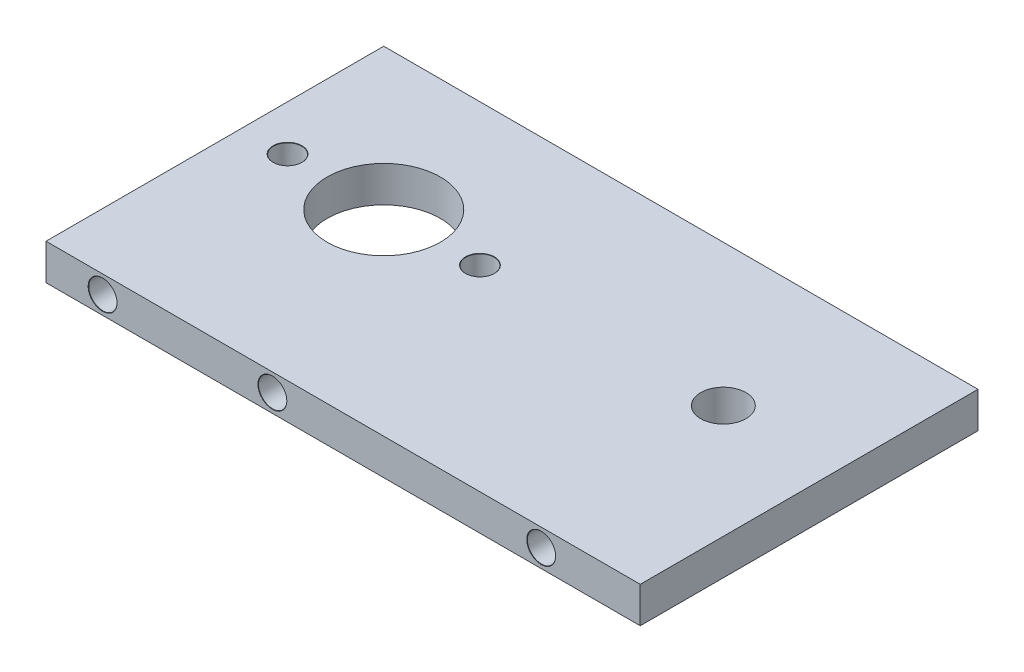
ISO-10303-21;
HEADER;
FILE_DESCRIPTION(('STEP AP214'),'2;1');
FILE_NAME('part.step','',(''),(''),'','','');
FILE_SCHEMA(('AUTOMOTIVE_DESIGN { 1 0 10303 214 1 1 1 1 }'));
ENDSEC;
DATA;
#1=APPLICATION_CONTEXT('core data for automotive mechanical design processes');
#2=APPLICATION_PROTOCOL_DEFINITION('international standard','automotive_design',2000,#1);
#3=PRODUCT_CONTEXT('',#1,'mechanical');
#4=PRODUCT('Part','Part','',(#3));
#5=PRODUCT_RELATED_PRODUCT_CATEGORY('part','',(#4));
#6=PRODUCT_DEFINITION_FORMATION('','',#4);
#7=PRODUCT_DEFINITION_CONTEXT('part definition',#1,'design');
#8=PRODUCT_DEFINITION('design','',#6,#7);
#9=PRODUCT_DEFINITION_SHAPE('','',#8);
#10=(LENGTH_UNIT() NAMED_UNIT(*) SI_UNIT(.MILLI.,.METRE.));
#11=(NAMED_UNIT(*) PLANE_ANGLE_UNIT() SI_UNIT($,.RADIAN.));
#12=(NAMED_UNIT(*) SI_UNIT($,.STERADIAN.) SOLID_ANGLE_UNIT());
#13=UNCERTAINTY_MEASURE_WITH_UNIT(LENGTH_MEASURE(1.E-05),#10,'distance_accuracy_value','');
#14=(GEOMETRIC_REPRESENTATION_CONTEXT(3) GLOBAL_UNCERTAINTY_ASSIGNED_CONTEXT((#13)) GLOBAL_UNIT_ASSIGNED_CONTEXT((#10,
#11,#12)) REPRESENTATION_CONTEXT('',''));
#15=CARTESIAN_POINT('',(0.,0.,0.));
#16=DIRECTION('',(0.,0.,1.));
#17=DIRECTION('',(1.,0.,0.));
#18=AXIS2_PLACEMENT_3D('',#15,#16,#17);
#19=CARTESIAN_POINT('',(-12.5,3.175,12.5000000000002));
#20=DIRECTION('',(1.,0.,0.));
#21=DIRECTION('',(0.,0.,-1.));
#22=AXIS2_PLACEMENT_3D('',#19,#20,#21);
#23=PLANE('',#22);
#24=DIRECTION('',(0.,0.,1.));
#25=VECTOR('',#24,1.);
#26=CARTESIAN_POINT('',(-12.5,0.,12.5000000000002));
#27=LINE('',#26,#25);
#28=CARTESIAN_POINT('',(-12.5,0.,-12.4999999999998));
#29=VERTEX_POINT('',#28);
#30=CARTESIAN_POINT('',(-12.5,0.,17.34));
#31=VERTEX_POINT('',#30);
#32=EDGE_CURVE('E72',#29,#31,#27,.T.);
#33=ORIENTED_EDGE('',*,*,#32,.T.);
#34=DIRECTION('',(0.,-1.,0.));
#35=VECTOR('',#34,1.);
#36=CARTESIAN_POINT('',(-12.5,3.175,17.34));
#37=LINE('',#36,#35);
#38=CARTESIAN_POINT('',(-12.5,3.175,17.34));
#39=VERTEX_POINT('',#38);
#40=EDGE_CURVE('E11',#39,#31,#37,.T.);
#41=ORIENTED_EDGE('',*,*,#40,.F.);
#42=DIRECTION('',(0.,0.,1.));
#43=VECTOR('',#42,1.);
#44=CARTESIAN_POINT('',(-12.5,3.175,12.5000000000002));
#45=LINE('',#44,#43);
#46=CARTESIAN_POINT('',(-12.5,3.175,-12.4999999999998));
#47=VERTEX_POINT('',#46);
#48=EDGE_CURVE('E173',#47,#39,#45,.T.);
#49=ORIENTED_EDGE('',*,*,#48,.F.);
#50=DIRECTION('',(0.,-1.,0.));
#51=VECTOR('',#50,1.);
#52=CARTESIAN_POINT('',(-12.5,3.175,-12.4999999999998));
#53=LINE('',#52,#51);
#54=EDGE_CURVE('E53',#47,#29,#53,.T.);
#55=ORIENTED_EDGE('',*,*,#54,.T.);
#56=EDGE_LOOP('',(#33,#41,#49,#55));
#57=FACE_BOUND('',#56,.T.);
#58=ADVANCED_FACE('F45',(#57),#23,.F.);
#59=CARTESIAN_POINT('',(-12.5,3.175,17.34));
#60=DIRECTION('',(0.,0.,-1.));
#61=DIRECTION('',(-1.,0.,0.));
#62=AXIS2_PLACEMENT_3D('',#59,#60,#61);
#63=PLANE('',#62);
#64=CARTESIAN_POINT('',(-7.5,1.5875,17.34));
#65=DIRECTION('',(0.,0.,1.));
#66=DIRECTION('',(1.,0.,0.));
#67=AXIS2_PLACEMENT_3D('',#64,#65,#66);
#68=CIRCLE('',#67,1.275);
#69=CARTESIAN_POINT('',(-6.225,1.5875,17.34));
#70=VERTEX_POINT('',#69);
#71=EDGE_CURVE('E114',#70,#70,#68,.T.);
#72=ORIENTED_EDGE('',*,*,#71,.F.);
#73=EDGE_LOOP('',(#72));
#74=FACE_BOUND('',#73,.T.);
#75=CARTESIAN_POINT('',(7.5,1.5875,17.34));
#76=DIRECTION('',(0.,0.,1.));
#77=DIRECTION('',(1.,0.,0.));
#78=AXIS2_PLACEMENT_3D('',#75,#76,#77);
#79=CIRCLE('',#78,1.275);
#80=CARTESIAN_POINT('',(8.775,1.5875,17.34));
#81=VERTEX_POINT('',#80);
#82=EDGE_CURVE('E107',#81,#81,#79,.T.);
#83=ORIENTED_EDGE('',*,*,#82,.F.);
#84=EDGE_LOOP('',(#83));
#85=FACE_BOUND('',#84,.T.);
#86=CARTESIAN_POINT('',(31.25,1.5875,17.34));
#87=DIRECTION('',(0.,0.,1.));
#88=DIRECTION('',(1.,0.,0.));
#89=AXIS2_PLACEMENT_3D('',#86,#87,#88);
#90=CIRCLE('',#89,1.275);
#91=CARTESIAN_POINT('',(32.525,1.5875,17.34));
#92=VERTEX_POINT('',#91);
#93=EDGE_CURVE('E123',#92,#92,#90,.T.);
#94=ORIENTED_EDGE('',*,*,#93,.F.);
#95=EDGE_LOOP('',(#94));
#96=FACE_BOUND('',#95,.T.);
#97=DIRECTION('',(1.,0.,0.));
#98=VECTOR('',#97,1.);
#99=CARTESIAN_POINT('',(-12.5,0.,17.34));
#100=LINE('',#99,#98);
#101=CARTESIAN_POINT('',(40.,0.,17.34));
#102=VERTEX_POINT('',#101);
#103=EDGE_CURVE('E78',#31,#102,#100,.T.);
#104=ORIENTED_EDGE('',*,*,#103,.T.);
#105=DIRECTION('',(0.,1.,0.));
#106=VECTOR('',#105,1.);
#107=CARTESIAN_POINT('',(40.,-40.5792508555788,17.34));
#108=LINE('',#107,#106);
#109=CARTESIAN_POINT('',(40.,3.175,17.34));
#110=VERTEX_POINT('',#109);
#111=EDGE_CURVE('E143',#102,#110,#108,.T.);
#112=ORIENTED_EDGE('',*,*,#111,.T.);
#113=DIRECTION('',(1.,0.,0.));
#114=VECTOR('',#113,1.);
#115=CARTESIAN_POINT('',(-12.5,3.175,17.34));
#116=LINE('',#115,#114);
#117=EDGE_CURVE('E175',#39,#110,#116,.T.);
#118=ORIENTED_EDGE('',*,*,#117,.F.);
#119=ORIENTED_EDGE('',*,*,#40,.T.);
#120=EDGE_LOOP('',(#104,#112,#118,#119));
#121=FACE_BOUND('',#120,.T.);
#122=ADVANCED_FACE('F193',(#74,#85,#96,#121),#63,.F.);
#123=CARTESIAN_POINT('',(12.5000000000001,3.175,-12.4999999999999));
#124=DIRECTION('',(0.,0.,1.));
#125=DIRECTION('',(1.,0.,0.));
#126=AXIS2_PLACEMENT_3D('',#123,#124,#125);
#127=PLANE('',#126);
#128=DIRECTION('',(-1.,0.,0.));
#129=VECTOR('',#128,1.);
#130=CARTESIAN_POINT('',(12.5000000000001,0.,-12.4999999999999));
#131=LINE('',#130,#129);
#132=CARTESIAN_POINT('',(40.,0.,-12.4999999999999));
#133=VERTEX_POINT('',#132);
#134=EDGE_CURVE('E176',#133,#29,#131,.T.);
#135=ORIENTED_EDGE('',*,*,#134,.T.);
#136=ORIENTED_EDGE('',*,*,#54,.F.);
#137=DIRECTION('',(-1.,0.,0.));
#138=VECTOR('',#137,1.);
#139=CARTESIAN_POINT('',(12.5000000000001,3.175,-12.4999999999999));
#140=LINE('',#139,#138);
#141=CARTESIAN_POINT('',(40.,3.175,-12.4999999999999));
#142=VERTEX_POINT('',#141);
#143=EDGE_CURVE('E61',#142,#47,#140,.T.);
#144=ORIENTED_EDGE('',*,*,#143,.F.);
#145=DIRECTION('',(0.,1.,0.));
#146=VECTOR('',#145,1.);
#147=CARTESIAN_POINT('',(40.,-40.5792508555788,-12.4999999999999));
#148=LINE('',#147,#146);
#149=EDGE_CURVE('E144',#133,#142,#148,.T.);
#150=ORIENTED_EDGE('',*,*,#149,.F.);
#151=EDGE_LOOP('',(#135,#136,#144,#150));
#152=FACE_BOUND('',#151,.T.);
#153=ADVANCED_FACE('F184',(#152),#127,.F.);
#154=CARTESIAN_POINT('',(0.,3.175,0.));
#155=DIRECTION('',(0.,1.,0.));
#156=DIRECTION('',(0.,0.,1.));
#157=AXIS2_PLACEMENT_3D('',#154,#155,#156);
#158=PLANE('',#157);
#159=CARTESIAN_POINT('',(0.,3.175,0.));
#160=DIRECTION('',(0.,1.,0.));
#161=DIRECTION('',(0.,0.,1.));
#162=AXIS2_PLACEMENT_3D('',#159,#160,#161);
#163=CIRCLE('',#162,5.);
#164=CARTESIAN_POINT('',(0.,3.175,5.));
#165=VERTEX_POINT('',#164);
#166=EDGE_CURVE('E136',#165,#165,#163,.T.);
#167=ORIENTED_EDGE('',*,*,#166,.F.);
#168=EDGE_LOOP('',(#167));
#169=FACE_BOUND('',#168,.T.);
#170=CARTESIAN_POINT('',(-8.5,3.175,0.));
#171=DIRECTION('',(0.,1.,0.));
#172=DIRECTION('',(0.,0.,1.));
#173=AXIS2_PLACEMENT_3D('',#170,#171,#172);
#174=CIRCLE('',#173,1.275);
#175=CARTESIAN_POINT('',(-8.5,3.175,1.275));
#176=VERTEX_POINT('',#175);
#177=EDGE_CURVE('E155',#176,#176,#174,.T.);
#178=ORIENTED_EDGE('',*,*,#177,.F.);
#179=EDGE_LOOP('',(#178));
#180=FACE_BOUND('',#179,.T.);
#181=CARTESIAN_POINT('',(8.5,3.175,0.));
#182=DIRECTION('',(0.,1.,0.));
#183=DIRECTION('',(0.,0.,1.));
#184=AXIS2_PLACEMENT_3D('',#181,#182,#183);
#185=CIRCLE('',#184,1.275);
#186=CARTESIAN_POINT('',(8.5,3.175,1.275));
#187=VERTEX_POINT('',#186);
#188=EDGE_CURVE('E164',#187,#187,#185,.T.);
#189=ORIENTED_EDGE('',*,*,#188,.F.);
#190=EDGE_LOOP('',(#189));
#191=FACE_BOUND('',#190,.T.);
#192=ORIENTED_EDGE('',*,*,#48,.T.);
#193=ORIENTED_EDGE('',*,*,#117,.T.);
#194=DIRECTION('',(0.,0.,1.));
#195=VECTOR('',#194,1.);
#196=CARTESIAN_POINT('',(40.,3.175,0.));
#197=LINE('',#196,#195);
#198=EDGE_CURVE('E140',#142,#110,#197,.T.);
#199=ORIENTED_EDGE('',*,*,#198,.F.);
#200=ORIENTED_EDGE('',*,*,#143,.T.);
#201=EDGE_LOOP('',(#192,#193,#199,#200));
#202=FACE_BOUND('',#201,.T.);
#203=CARTESIAN_POINT('',(30.,3.175,0.));
#204=DIRECTION('',(0.,1.,0.));
#205=DIRECTION('',(0.,0.,1.));
#206=AXIS2_PLACEMENT_3D('',#203,#204,#205);
#207=CIRCLE('',#206,2.);
#208=CARTESIAN_POINT('',(30.,3.175,2.));
#209=VERTEX_POINT('',#208);
#210=EDGE_CURVE('E132',#209,#209,#207,.T.);
#211=ORIENTED_EDGE('',*,*,#210,.F.);
#212=EDGE_LOOP('',(#211));
#213=FACE_BOUND('',#212,.T.);
#214=ADVANCED_FACE('F194',(#169,#180,#191,#202,#213),#158,.T.);
#215=CARTESIAN_POINT('',(0.,0.,0.));
#216=DIRECTION('',(0.,1.,0.));
#217=DIRECTION('',(0.,0.,1.));
#218=AXIS2_PLACEMENT_3D('',#215,#216,#217);
#219=PLANE('',#218);
#220=CARTESIAN_POINT('',(0.,0.,0.));
#221=DIRECTION('',(0.,1.,0.));
#222=DIRECTION('',(0.,0.,1.));
#223=AXIS2_PLACEMENT_3D('',#220,#221,#222);
#224=CIRCLE('',#223,5.);
#225=CARTESIAN_POINT('',(0.,0.,5.));
#226=VERTEX_POINT('',#225);
#227=EDGE_CURVE('E152',#226,#226,#224,.F.);
#228=ORIENTED_EDGE('',*,*,#227,.F.);
#229=EDGE_LOOP('',(#228));
#230=FACE_BOUND('',#229,.T.);
#231=CARTESIAN_POINT('',(-8.5,0.,0.));
#232=DIRECTION('',(0.,1.,0.));
#233=DIRECTION('',(0.,0.,1.));
#234=AXIS2_PLACEMENT_3D('',#231,#232,#233);
#235=CIRCLE('',#234,1.25);
#236=CARTESIAN_POINT('',(-8.5,0.,1.25));
#237=VERTEX_POINT('',#236);
#238=EDGE_CURVE('E161',#237,#237,#235,.T.);
#239=ORIENTED_EDGE('',*,*,#238,.T.);
#240=EDGE_LOOP('',(#239));
#241=FACE_BOUND('',#240,.T.);
#242=CARTESIAN_POINT('',(8.5,0.,0.));
#243=DIRECTION('',(0.,1.,0.));
#244=DIRECTION('',(0.,0.,1.));
#245=AXIS2_PLACEMENT_3D('',#242,#243,#244);
#246=CIRCLE('',#245,1.25);
#247=CARTESIAN_POINT('',(8.5,0.,1.25));
#248=VERTEX_POINT('',#247);
#249=EDGE_CURVE('E170',#248,#248,#246,.T.);
#250=ORIENTED_EDGE('',*,*,#249,.T.);
#251=EDGE_LOOP('',(#250));
#252=FACE_BOUND('',#251,.T.);
#253=ORIENTED_EDGE('',*,*,#32,.F.);
#254=ORIENTED_EDGE('',*,*,#134,.F.);
#255=DIRECTION('',(0.,0.,-1.));
#256=VECTOR('',#255,1.);
#257=CARTESIAN_POINT('',(40.,0.,0.));
#258=LINE('',#257,#256);
#259=EDGE_CURVE('E137',#102,#133,#258,.T.);
#260=ORIENTED_EDGE('',*,*,#259,.F.);
#261=ORIENTED_EDGE('',*,*,#103,.F.);
#262=EDGE_LOOP('',(#253,#254,#260,#261));
#263=FACE_BOUND('',#262,.T.);
#264=CARTESIAN_POINT('',(30.,0.,0.));
#265=DIRECTION('',(0.,1.,0.));
#266=DIRECTION('',(0.,0.,1.));
#267=AXIS2_PLACEMENT_3D('',#264,#265,#266);
#268=CIRCLE('',#267,2.);
#269=CARTESIAN_POINT('',(30.,0.,2.));
#270=VERTEX_POINT('',#269);
#271=EDGE_CURVE('E133',#270,#270,#268,.F.);
#272=ORIENTED_EDGE('',*,*,#271,.F.);
#273=EDGE_LOOP('',(#272));
#274=FACE_BOUND('',#273,.T.);
#275=ADVANCED_FACE('F187',(#230,#241,#252,#263,#274),#219,.F.);
#276=CARTESIAN_POINT('',(8.5,3.175,0.));
#277=DIRECTION('',(0.,1.,0.));
#278=DIRECTION('',(0.,0.,1.));
#279=AXIS2_PLACEMENT_3D('',#276,#277,#278);
#280=CYLINDRICAL_SURFACE('',#279,1.25);
#281=ORIENTED_EDGE('',*,*,#249,.F.);
#282=EDGE_LOOP('',(#281));
#283=FACE_BOUND('',#282,.T.);
#284=CARTESIAN_POINT('',(8.5,3.15,0.));
#285=DIRECTION('',(0.,1.,0.));
#286=DIRECTION('',(0.,0.,1.));
#287=AXIS2_PLACEMENT_3D('',#284,#285,#286);
#288=CIRCLE('',#287,1.25);
#289=CARTESIAN_POINT('',(8.5,3.15,1.25));
#290=VERTEX_POINT('',#289);
#291=EDGE_CURVE('E167',#290,#290,#288,.T.);
#292=ORIENTED_EDGE('',*,*,#291,.T.);
#293=EDGE_LOOP('',(#292));
#294=FACE_BOUND('',#293,.T.);
#295=ADVANCED_FACE('F230',(#283,#294),#280,.F.);
#296=CARTESIAN_POINT('',(8.5,3.175,0.));
#297=DIRECTION('',(0.,1.,0.));
#298=DIRECTION('',(0.,0.,1.));
#299=AXIS2_PLACEMENT_3D('',#296,#297,#298);
#300=CONICAL_SURFACE('',#299,1.275,0.785398163397414);
#301=ORIENTED_EDGE('',*,*,#291,.F.);
#302=EDGE_LOOP('',(#301));
#303=FACE_BOUND('',#302,.T.);
#304=ORIENTED_EDGE('',*,*,#188,.T.);
#305=EDGE_LOOP('',(#304));
#306=FACE_BOUND('',#305,.T.);
#307=ADVANCED_FACE('F234',(#303,#306),#300,.F.);
#308=CARTESIAN_POINT('',(-8.5,3.175,0.));
#309=DIRECTION('',(0.,1.,0.));
#310=DIRECTION('',(0.,0.,1.));
#311=AXIS2_PLACEMENT_3D('',#308,#309,#310);
#312=CYLINDRICAL_SURFACE('',#311,1.25);
#313=ORIENTED_EDGE('',*,*,#238,.F.);
#314=EDGE_LOOP('',(#313));
#315=FACE_BOUND('',#314,.T.);
#316=CARTESIAN_POINT('',(-8.5,3.15,0.));
#317=DIRECTION('',(0.,1.,0.));
#318=DIRECTION('',(0.,0.,1.));
#319=AXIS2_PLACEMENT_3D('',#316,#317,#318);
#320=CIRCLE('',#319,1.25);
#321=CARTESIAN_POINT('',(-8.5,3.15,1.25));
#322=VERTEX_POINT('',#321);
#323=EDGE_CURVE('E158',#322,#322,#320,.T.);
#324=ORIENTED_EDGE('',*,*,#323,.T.);
#325=EDGE_LOOP('',(#324));
#326=FACE_BOUND('',#325,.T.);
#327=ADVANCED_FACE('F238',(#315,#326),#312,.F.);
#328=CARTESIAN_POINT('',(-8.5,3.175,0.));
#329=DIRECTION('',(0.,1.,0.));
#330=DIRECTION('',(0.,0.,1.));
#331=AXIS2_PLACEMENT_3D('',#328,#329,#330);
#332=CONICAL_SURFACE('',#331,1.275,0.785398163397414);
#333=ORIENTED_EDGE('',*,*,#323,.F.);
#334=EDGE_LOOP('',(#333));
#335=FACE_BOUND('',#334,.T.);
#336=ORIENTED_EDGE('',*,*,#177,.T.);
#337=EDGE_LOOP('',(#336));
#338=FACE_BOUND('',#337,.T.);
#339=ADVANCED_FACE('F213',(#335,#338),#332,.F.);
#340=CARTESIAN_POINT('',(0.,-0.00100000000000013,0.));
#341=DIRECTION('',(0.,1.,0.));
#342=DIRECTION('',(0.,0.,1.));
#343=AXIS2_PLACEMENT_3D('',#340,#341,#342);
#344=CYLINDRICAL_SURFACE('',#343,5.);
#345=ORIENTED_EDGE('',*,*,#166,.T.);
#346=EDGE_LOOP('',(#345));
#347=FACE_BOUND('',#346,.T.);
#348=ORIENTED_EDGE('',*,*,#227,.T.);
#349=EDGE_LOOP('',(#348));
#350=FACE_BOUND('',#349,.T.);
#351=ADVANCED_FACE('F203',(#347,#350),#344,.F.);
#352=CARTESIAN_POINT('',(30.,-40.5792508555788,0.));
#353=DIRECTION('',(0.,1.,0.));
#354=DIRECTION('',(0.,0.,1.));
#355=AXIS2_PLACEMENT_3D('',#352,#353,#354);
#356=CYLINDRICAL_SURFACE('',#355,2.);
#357=ORIENTED_EDGE('',*,*,#271,.T.);
#358=EDGE_LOOP('',(#357));
#359=FACE_BOUND('',#358,.T.);
#360=ORIENTED_EDGE('',*,*,#210,.T.);
#361=EDGE_LOOP('',(#360));
#362=FACE_BOUND('',#361,.T.);
#363=ADVANCED_FACE('F201',(#359,#362),#356,.F.);
#364=CARTESIAN_POINT('',(40.,-40.5792508555788,0.));
#365=DIRECTION('',(-1.,0.,0.));
#366=DIRECTION('',(0.,0.,1.));
#367=AXIS2_PLACEMENT_3D('',#364,#365,#366);
#368=PLANE('',#367);
#369=ORIENTED_EDGE('',*,*,#111,.F.);
#370=ORIENTED_EDGE('',*,*,#259,.T.);
#371=ORIENTED_EDGE('',*,*,#149,.T.);
#372=ORIENTED_EDGE('',*,*,#198,.T.);
#373=EDGE_LOOP('',(#369,#370,#371,#372));
#374=FACE_BOUND('',#373,.T.);
#375=ADVANCED_FACE('F191',(#374),#368,.F.);
#376=CARTESIAN_POINT('',(31.25,1.5875,5.34000000000002));
#377=DIRECTION('',(0.,0.,1.));
#378=DIRECTION('',(1.,0.,0.));
#379=AXIS2_PLACEMENT_3D('',#376,#377,#378);
#380=CONICAL_SURFACE('',#379,1.25,1.02974425867665);
#381=CARTESIAN_POINT('',(31.25,1.5875,4.58892422621557));
#382=VERTEX_POINT('',#381);
#383=VERTEX_LOOP('',#382);
#384=FACE_BOUND('',#383,.T.);
#385=CARTESIAN_POINT('',(31.25,1.5875,5.34000000000002));
#386=DIRECTION('',(0.,0.,1.));
#387=DIRECTION('',(1.,0.,0.));
#388=AXIS2_PLACEMENT_3D('',#385,#386,#387);
#389=CIRCLE('',#388,1.25);
#390=CARTESIAN_POINT('',(32.5,1.5875,5.34000000000002));
#391=VERTEX_POINT('',#390);
#392=EDGE_CURVE('E129',#391,#391,#389,.T.);
#393=ORIENTED_EDGE('',*,*,#392,.T.);
#394=EDGE_LOOP('',(#393));
#395=FACE_BOUND('',#394,.T.);
#396=ADVANCED_FACE('F210',(#384,#395),#380,.F.);
#397=CARTESIAN_POINT('',(31.25,1.5875,17.34));
#398=DIRECTION('',(0.,0.,1.));
#399=DIRECTION('',(1.,0.,0.));
#400=AXIS2_PLACEMENT_3D('',#397,#398,#399);
#401=CYLINDRICAL_SURFACE('',#400,1.25);
#402=ORIENTED_EDGE('',*,*,#392,.F.);
#403=EDGE_LOOP('',(#402));
#404=FACE_BOUND('',#403,.T.);
#405=CARTESIAN_POINT('',(31.25,1.5875,17.315));
#406=DIRECTION('',(0.,0.,1.));
#407=DIRECTION('',(1.,0.,0.));
#408=AXIS2_PLACEMENT_3D('',#405,#406,#407);
#409=CIRCLE('',#408,1.25);
#410=CARTESIAN_POINT('',(32.5,1.5875,17.315));
#411=VERTEX_POINT('',#410);
#412=EDGE_CURVE('E126',#411,#411,#409,.T.);
#413=ORIENTED_EDGE('',*,*,#412,.T.);
#414=EDGE_LOOP('',(#413));
#415=FACE_BOUND('',#414,.T.);
#416=ADVANCED_FACE('F299',(#404,#415),#401,.F.);
#417=CARTESIAN_POINT('',(31.25,1.5875,17.34));
#418=DIRECTION('',(0.,0.,1.));
#419=DIRECTION('',(1.,0.,0.));
#420=AXIS2_PLACEMENT_3D('',#417,#418,#419);
#421=CONICAL_SURFACE('',#420,1.275,0.78539816339731);
#422=ORIENTED_EDGE('',*,*,#412,.F.);
#423=EDGE_LOOP('',(#422));
#424=FACE_BOUND('',#423,.T.);
#425=ORIENTED_EDGE('',*,*,#93,.T.);
#426=EDGE_LOOP('',(#425));
#427=FACE_BOUND('',#426,.T.);
#428=ADVANCED_FACE('F309',(#424,#427),#421,.F.);
#429=CARTESIAN_POINT('',(7.5,1.5875,5.34000000000002));
#430=DIRECTION('',(0.,0.,1.));
#431=DIRECTION('',(1.,0.,0.));
#432=AXIS2_PLACEMENT_3D('',#429,#430,#431);
#433=CONICAL_SURFACE('',#432,1.25,1.02974425867665);
#434=CARTESIAN_POINT('',(7.5,1.5875,4.58892422621557));
#435=VERTEX_POINT('',#434);
#436=VERTEX_LOOP('',#435);
#437=FACE_BOUND('',#436,.T.);
#438=CARTESIAN_POINT('',(7.5,1.5875,5.34000000000002));
#439=DIRECTION('',(0.,0.,1.));
#440=DIRECTION('',(1.,0.,0.));
#441=AXIS2_PLACEMENT_3D('',#438,#439,#440);
#442=CIRCLE('',#441,1.25);
#443=CARTESIAN_POINT('',(8.75,1.5875,5.34000000000002));
#444=VERTEX_POINT('',#443);
#445=EDGE_CURVE('E120',#444,#444,#442,.T.);
#446=ORIENTED_EDGE('',*,*,#445,.T.);
#447=EDGE_LOOP('',(#446));
#448=FACE_BOUND('',#447,.T.);
#449=ADVANCED_FACE('F319',(#437,#448),#433,.F.);
#450=CARTESIAN_POINT('',(7.5,1.5875,17.34));
#451=DIRECTION('',(0.,0.,1.));
#452=DIRECTION('',(1.,0.,0.));
#453=AXIS2_PLACEMENT_3D('',#450,#451,#452);
#454=CYLINDRICAL_SURFACE('',#453,1.25);
#455=ORIENTED_EDGE('',*,*,#445,.F.);
#456=EDGE_LOOP('',(#455));
#457=FACE_BOUND('',#456,.T.);
#458=CARTESIAN_POINT('',(7.5,1.5875,17.315));
#459=DIRECTION('',(0.,0.,1.));
#460=DIRECTION('',(1.,0.,0.));
#461=AXIS2_PLACEMENT_3D('',#458,#459,#460);
#462=CIRCLE('',#461,1.25);
#463=CARTESIAN_POINT('',(8.75,1.5875,17.315));
#464=VERTEX_POINT('',#463);
#465=EDGE_CURVE('E111',#464,#464,#462,.T.);
#466=ORIENTED_EDGE('',*,*,#465,.T.);
#467=EDGE_LOOP('',(#466));
#468=FACE_BOUND('',#467,.T.);
#469=ADVANCED_FACE('F329',(#457,#468),#454,.F.);
#470=CARTESIAN_POINT('',(7.5,1.5875,17.34));
#471=DIRECTION('',(0.,0.,1.));
#472=DIRECTION('',(1.,0.,0.));
#473=AXIS2_PLACEMENT_3D('',#470,#471,#472);
#474=CONICAL_SURFACE('',#473,1.275,0.785398163397379);
#475=ORIENTED_EDGE('',*,*,#465,.F.);
#476=EDGE_LOOP('',(#475));
#477=FACE_BOUND('',#476,.T.);
#478=ORIENTED_EDGE('',*,*,#82,.T.);
#479=EDGE_LOOP('',(#478));
#480=FACE_BOUND('',#479,.T.);
#481=ADVANCED_FACE('F101',(#477,#480),#474,.F.);
#482=CARTESIAN_POINT('',(-7.5,1.5875,5.34000000000002));
#483=DIRECTION('',(0.,0.,1.));
#484=DIRECTION('',(1.,0.,0.));
#485=AXIS2_PLACEMENT_3D('',#482,#483,#484);
#486=CONICAL_SURFACE('',#485,1.25,1.02974425867665);
#487=CARTESIAN_POINT('',(-7.5,1.5875,4.58892422621557));
#488=VERTEX_POINT('',#487);
#489=VERTEX_LOOP('',#488);
#490=FACE_BOUND('',#489,.T.);
#491=CARTESIAN_POINT('',(-7.5,1.5875,5.34000000000002));
#492=DIRECTION('',(0.,0.,1.));
#493=DIRECTION('',(1.,0.,0.));
#494=AXIS2_PLACEMENT_3D('',#491,#492,#493);
#495=CIRCLE('',#494,1.25);
#496=CARTESIAN_POINT('',(-6.25,1.5875,5.34000000000002));
#497=VERTEX_POINT('',#496);
#498=EDGE_CURVE('E105',#497,#497,#495,.T.);
#499=ORIENTED_EDGE('',*,*,#498,.T.);
#500=EDGE_LOOP('',(#499));
#501=FACE_BOUND('',#500,.T.);
#502=ADVANCED_FACE('F97',(#490,#501),#486,.F.);
#503=CARTESIAN_POINT('',(-7.5,1.5875,17.34));
#504=DIRECTION('',(0.,0.,1.));
#505=DIRECTION('',(1.,0.,0.));
#506=AXIS2_PLACEMENT_3D('',#503,#504,#505);
#507=CYLINDRICAL_SURFACE('',#506,1.25);
#508=ORIENTED_EDGE('',*,*,#498,.F.);
#509=EDGE_LOOP('',(#508));
#510=FACE_BOUND('',#509,.T.);
#511=CARTESIAN_POINT('',(-7.5,1.5875,17.315));
#512=DIRECTION('',(0.,0.,1.));
#513=DIRECTION('',(1.,0.,0.));
#514=AXIS2_PLACEMENT_3D('',#511,#512,#513);
#515=CIRCLE('',#514,1.25);
#516=CARTESIAN_POINT('',(-6.25,1.5875,17.315));
#517=VERTEX_POINT('',#516);
#518=EDGE_CURVE('E108',#517,#517,#515,.T.);
#519=ORIENTED_EDGE('',*,*,#518,.T.);
#520=EDGE_LOOP('',(#519));
#521=FACE_BOUND('',#520,.T.);
#522=ADVANCED_FACE('F100',(#510,#521),#507,.F.);
#523=CARTESIAN_POINT('',(-7.5,1.5875,17.34));
#524=DIRECTION('',(0.,0.,1.));
#525=DIRECTION('',(1.,0.,0.));
#526=AXIS2_PLACEMENT_3D('',#523,#524,#525);
#527=CONICAL_SURFACE('',#526,1.275,0.785398163397396);
#528=ORIENTED_EDGE('',*,*,#518,.F.);
#529=EDGE_LOOP('',(#528));
#530=FACE_BOUND('',#529,.T.);
#531=ORIENTED_EDGE('',*,*,#71,.T.);
#532=EDGE_LOOP('',(#531));
#533=FACE_BOUND('',#532,.T.);
#534=ADVANCED_FACE('F363',(#530,#533),#527,.F.);
#535=CLOSED_SHELL('',(#58,#122,#153,#214,#275,#295,#307,#327,#339,#351,#363,#375,#396,#416,#428,
#449,#469,#481,#502,#522,#534));
#536=MANIFOLD_SOLID_BREP('B2',#535);
#537=ADVANCED_BREP_SHAPE_REPRESENTATION('',(#18,#536),#14);
#538=SHAPE_DEFINITION_REPRESENTATION(#9,#537);
ENDSEC;
END-ISO-10303-21;
